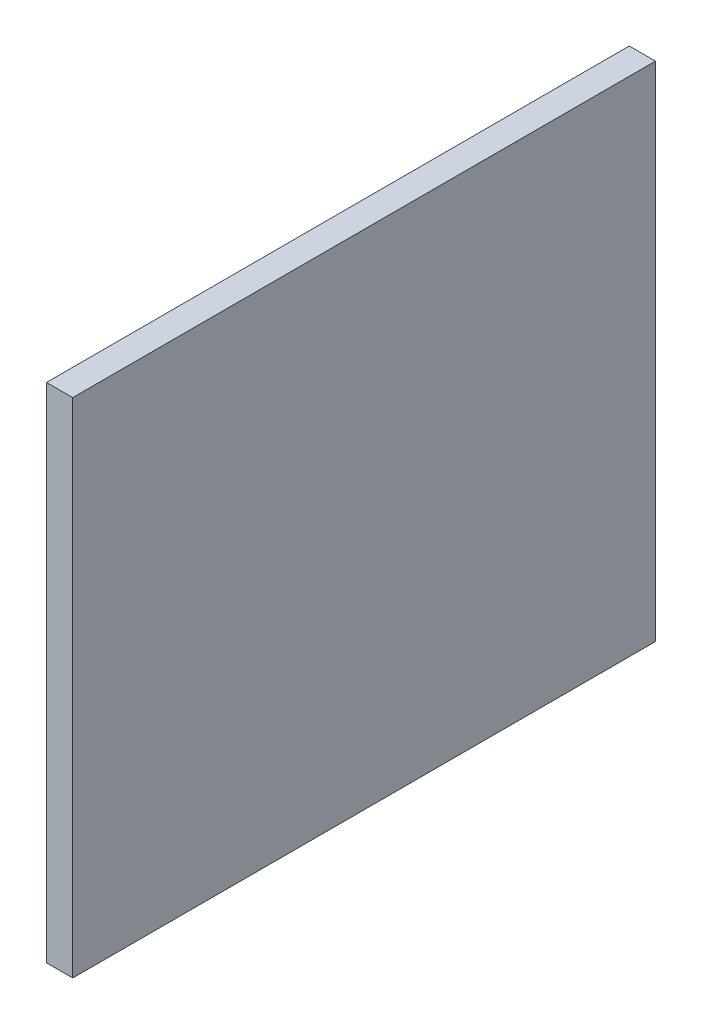
ISO-10303-21;
HEADER;
FILE_DESCRIPTION(('STEP AP214'),'2;1');
FILE_NAME('part.step','',(''),(''),'','','');
FILE_SCHEMA(('AUTOMOTIVE_DESIGN { 1 0 10303 214 1 1 1 1 }'));
ENDSEC;
DATA;
#1=APPLICATION_CONTEXT('core data for automotive mechanical design processes');
#2=APPLICATION_PROTOCOL_DEFINITION('international standard','automotive_design',2000,#1);
#3=PRODUCT_CONTEXT('',#1,'mechanical');
#4=PRODUCT('Part','Part','',(#3));
#5=PRODUCT_RELATED_PRODUCT_CATEGORY('part','',(#4));
#6=PRODUCT_DEFINITION_FORMATION('','',#4);
#7=PRODUCT_DEFINITION_CONTEXT('part definition',#1,'design');
#8=PRODUCT_DEFINITION('design','',#6,#7);
#9=PRODUCT_DEFINITION_SHAPE('','',#8);
#10=(LENGTH_UNIT() NAMED_UNIT(*) SI_UNIT(.MILLI.,.METRE.));
#11=(NAMED_UNIT(*) PLANE_ANGLE_UNIT() SI_UNIT($,.RADIAN.));
#12=(NAMED_UNIT(*) SI_UNIT($,.STERADIAN.) SOLID_ANGLE_UNIT());
#13=UNCERTAINTY_MEASURE_WITH_UNIT(LENGTH_MEASURE(1.E-05),#10,'distance_accuracy_value','');
#14=(GEOMETRIC_REPRESENTATION_CONTEXT(3) GLOBAL_UNCERTAINTY_ASSIGNED_CONTEXT((#13)) GLOBAL_UNIT_ASSIGNED_CONTEXT((#10,
#11,#12)) REPRESENTATION_CONTEXT('',''));
#15=CARTESIAN_POINT('',(0.,0.,0.));
#16=DIRECTION('',(0.,0.,1.));
#17=DIRECTION('',(1.,0.,0.));
#18=AXIS2_PLACEMENT_3D('',#15,#16,#17);
#19=CARTESIAN_POINT('',(18.,-172.5,-200.));
#20=DIRECTION('',(0.,0.,1.));
#21=DIRECTION('',(1.,0.,0.));
#22=AXIS2_PLACEMENT_3D('',#19,#20,#21);
#23=PLANE('',#22);
#24=DIRECTION('',(0.,1.,0.));
#25=VECTOR('',#24,1.);
#26=CARTESIAN_POINT('',(0.,-172.5,-200.));
#27=LINE('',#26,#25);
#28=CARTESIAN_POINT('',(0.,-172.5,-200.));
#29=VERTEX_POINT('',#28);
#30=CARTESIAN_POINT('',(0.,172.5,-200.));
#31=VERTEX_POINT('',#30);
#32=EDGE_CURVE('E95',#29,#31,#27,.T.);
#33=ORIENTED_EDGE('',*,*,#32,.T.);
#34=DIRECTION('',(-1.,0.,0.));
#35=VECTOR('',#34,1.);
#36=CARTESIAN_POINT('',(18.,172.5,-200.));
#37=LINE('',#36,#35);
#38=CARTESIAN_POINT('',(18.,172.5,-200.));
#39=VERTEX_POINT('',#38);
#40=EDGE_CURVE('E11',#39,#31,#37,.T.);
#41=ORIENTED_EDGE('',*,*,#40,.F.);
#42=DIRECTION('',(0.,1.,0.));
#43=VECTOR('',#42,1.);
#44=CARTESIAN_POINT('',(18.,-172.5,-200.));
#45=LINE('',#44,#43);
#46=CARTESIAN_POINT('',(18.,-172.5,-200.));
#47=VERTEX_POINT('',#46);
#48=EDGE_CURVE('E83',#47,#39,#45,.T.);
#49=ORIENTED_EDGE('',*,*,#48,.F.);
#50=DIRECTION('',(-1.,0.,0.));
#51=VECTOR('',#50,1.);
#52=CARTESIAN_POINT('',(18.,-172.5,-200.));
#53=LINE('',#52,#51);
#54=EDGE_CURVE('E91',#47,#29,#53,.T.);
#55=ORIENTED_EDGE('',*,*,#54,.T.);
#56=EDGE_LOOP('',(#33,#41,#49,#55));
#57=FACE_BOUND('',#56,.T.);
#58=ADVANCED_FACE('F32',(#57),#23,.F.);
#59=CARTESIAN_POINT('',(18.,172.5,200.));
#60=DIRECTION('',(0.,-1.,0.));
#61=DIRECTION('',(0.,0.,-1.));
#62=AXIS2_PLACEMENT_3D('',#59,#60,#61);
#63=PLANE('',#62);
#64=DIRECTION('',(0.,0.,1.));
#65=VECTOR('',#64,1.);
#66=CARTESIAN_POINT('',(0.,172.5,200.));
#67=LINE('',#66,#65);
#68=CARTESIAN_POINT('',(0.,172.5,200.));
#69=VERTEX_POINT('',#68);
#70=EDGE_CURVE('E87',#31,#69,#67,.T.);
#71=ORIENTED_EDGE('',*,*,#70,.T.);
#72=DIRECTION('',(-1.,0.,0.));
#73=VECTOR('',#72,1.);
#74=CARTESIAN_POINT('',(18.,172.5,200.));
#75=LINE('',#74,#73);
#76=CARTESIAN_POINT('',(18.,172.5,200.));
#77=VERTEX_POINT('',#76);
#78=EDGE_CURVE('E40',#77,#69,#75,.T.);
#79=ORIENTED_EDGE('',*,*,#78,.F.);
#80=DIRECTION('',(0.,0.,1.));
#81=VECTOR('',#80,1.);
#82=CARTESIAN_POINT('',(18.,172.5,200.));
#83=LINE('',#82,#81);
#84=EDGE_CURVE('E78',#39,#77,#83,.T.);
#85=ORIENTED_EDGE('',*,*,#84,.F.);
#86=ORIENTED_EDGE('',*,*,#40,.T.);
#87=EDGE_LOOP('',(#71,#79,#85,#86));
#88=FACE_BOUND('',#87,.T.);
#89=ADVANCED_FACE('F86',(#88),#63,.F.);
#90=CARTESIAN_POINT('',(18.,-172.5,200.));
#91=DIRECTION('',(0.,0.,-1.));
#92=DIRECTION('',(-1.,0.,0.));
#93=AXIS2_PLACEMENT_3D('',#90,#91,#92);
#94=PLANE('',#93);
#95=DIRECTION('',(0.,-1.,0.));
#96=VECTOR('',#95,1.);
#97=CARTESIAN_POINT('',(0.,-172.5,200.));
#98=LINE('',#97,#96);
#99=CARTESIAN_POINT('',(0.,-172.5,200.));
#100=VERTEX_POINT('',#99);
#101=EDGE_CURVE('E65',#69,#100,#98,.T.);
#102=ORIENTED_EDGE('',*,*,#101,.T.);
#103=DIRECTION('',(-1.,0.,0.));
#104=VECTOR('',#103,1.);
#105=CARTESIAN_POINT('',(18.,-172.5,200.));
#106=LINE('',#105,#104);
#107=CARTESIAN_POINT('',(18.,-172.5,200.));
#108=VERTEX_POINT('',#107);
#109=EDGE_CURVE('E88',#108,#100,#106,.T.);
#110=ORIENTED_EDGE('',*,*,#109,.F.);
#111=DIRECTION('',(0.,-1.,0.));
#112=VECTOR('',#111,1.);
#113=CARTESIAN_POINT('',(18.,-172.5,200.));
#114=LINE('',#113,#112);
#115=EDGE_CURVE('E81',#77,#108,#114,.T.);
#116=ORIENTED_EDGE('',*,*,#115,.F.);
#117=ORIENTED_EDGE('',*,*,#78,.T.);
#118=EDGE_LOOP('',(#102,#110,#116,#117));
#119=FACE_BOUND('',#118,.T.);
#120=ADVANCED_FACE('F89',(#119),#94,.F.);
#121=CARTESIAN_POINT('',(18.,-172.5,200.));
#122=DIRECTION('',(0.,1.,0.));
#123=DIRECTION('',(0.,0.,1.));
#124=AXIS2_PLACEMENT_3D('',#121,#122,#123);
#125=PLANE('',#124);
#126=DIRECTION('',(0.,0.,-1.));
#127=VECTOR('',#126,1.);
#128=CARTESIAN_POINT('',(0.,-172.5,200.));
#129=LINE('',#128,#127);
#130=EDGE_CURVE('E71',#100,#29,#129,.T.);
#131=ORIENTED_EDGE('',*,*,#130,.T.);
#132=ORIENTED_EDGE('',*,*,#54,.F.);
#133=DIRECTION('',(0.,0.,-1.));
#134=VECTOR('',#133,1.);
#135=CARTESIAN_POINT('',(18.,-172.5,200.));
#136=LINE('',#135,#134);
#137=EDGE_CURVE('E48',#108,#47,#136,.T.);
#138=ORIENTED_EDGE('',*,*,#137,.F.);
#139=ORIENTED_EDGE('',*,*,#109,.T.);
#140=EDGE_LOOP('',(#131,#132,#138,#139));
#141=FACE_BOUND('',#140,.T.);
#142=ADVANCED_FACE('F102',(#141),#125,.F.);
#143=CARTESIAN_POINT('',(18.,0.,0.));
#144=DIRECTION('',(-1.,0.,0.));
#145=DIRECTION('',(0.,0.,1.));
#146=AXIS2_PLACEMENT_3D('',#143,#144,#145);
#147=PLANE('',#146);
#148=ORIENTED_EDGE('',*,*,#48,.T.);
#149=ORIENTED_EDGE('',*,*,#84,.T.);
#150=ORIENTED_EDGE('',*,*,#115,.T.);
#151=ORIENTED_EDGE('',*,*,#137,.T.);
#152=EDGE_LOOP('',(#148,#149,#150,#151));
#153=FACE_BOUND('',#152,.T.);
#154=ADVANCED_FACE('F79',(#153),#147,.F.);
#155=CARTESIAN_POINT('',(0.,0.,0.));
#156=DIRECTION('',(-1.,0.,0.));
#157=DIRECTION('',(0.,0.,1.));
#158=AXIS2_PLACEMENT_3D('',#155,#156,#157);
#159=PLANE('',#158);
#160=ORIENTED_EDGE('',*,*,#32,.F.);
#161=ORIENTED_EDGE('',*,*,#130,.F.);
#162=ORIENTED_EDGE('',*,*,#101,.F.);
#163=ORIENTED_EDGE('',*,*,#70,.F.);
#164=EDGE_LOOP('',(#160,#161,#162,#163));
#165=FACE_BOUND('',#164,.T.);
#166=ADVANCED_FACE('F105',(#165),#159,.T.);
#167=CLOSED_SHELL('',(#58,#89,#120,#142,#154,#166));
#168=MANIFOLD_SOLID_BREP('B2',#167);
#169=ADVANCED_BREP_SHAPE_REPRESENTATION('',(#18,#168),#14);
#170=SHAPE_DEFINITION_REPRESENTATION(#9,#169);
ENDSEC;
END-ISO-10303-21;
